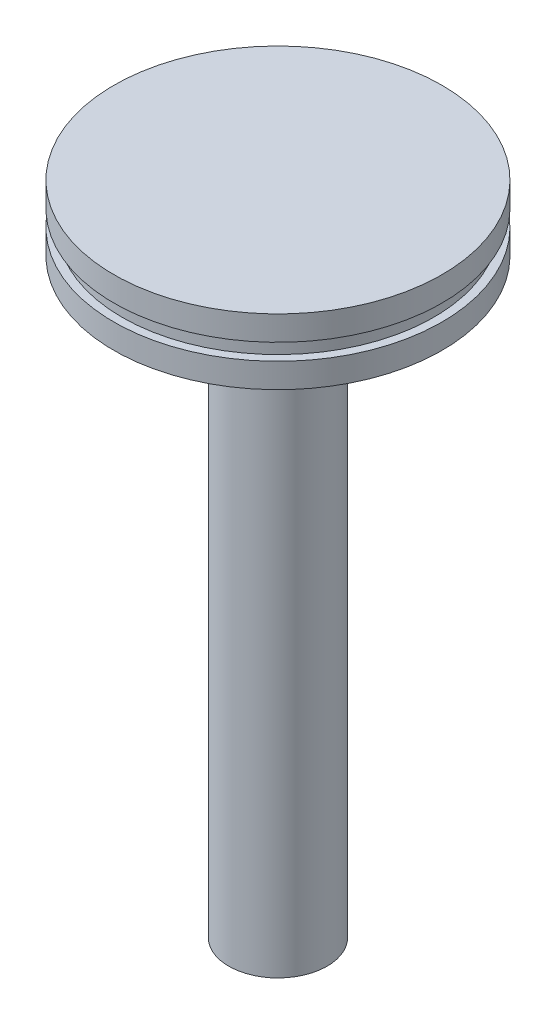
ISO-10303-21;
HEADER;
FILE_DESCRIPTION(('STEP AP214'),'2;1');
FILE_NAME('part.step','',(''),(''),'','','');
FILE_SCHEMA(('AUTOMOTIVE_DESIGN { 1 0 10303 214 1 1 1 1 }'));
ENDSEC;
DATA;
#1=APPLICATION_CONTEXT('core data for automotive mechanical design processes');
#2=APPLICATION_PROTOCOL_DEFINITION('international standard','automotive_design',2000,#1);
#3=PRODUCT_CONTEXT('',#1,'mechanical');
#4=PRODUCT('Part','Part','',(#3));
#5=PRODUCT_RELATED_PRODUCT_CATEGORY('part','',(#4));
#6=PRODUCT_DEFINITION_FORMATION('','',#4);
#7=PRODUCT_DEFINITION_CONTEXT('part definition',#1,'design');
#8=PRODUCT_DEFINITION('design','',#6,#7);
#9=PRODUCT_DEFINITION_SHAPE('','',#8);
#10=(LENGTH_UNIT() NAMED_UNIT(*) SI_UNIT(.MILLI.,.METRE.));
#11=(NAMED_UNIT(*) PLANE_ANGLE_UNIT() SI_UNIT($,.RADIAN.));
#12=(NAMED_UNIT(*) SI_UNIT($,.STERADIAN.) SOLID_ANGLE_UNIT());
#13=UNCERTAINTY_MEASURE_WITH_UNIT(LENGTH_MEASURE(1.E-05),#10,'distance_accuracy_value','');
#14=(GEOMETRIC_REPRESENTATION_CONTEXT(3) GLOBAL_UNCERTAINTY_ASSIGNED_CONTEXT((#13)) GLOBAL_UNIT_ASSIGNED_CONTEXT((#10,
#11,#12)) REPRESENTATION_CONTEXT('',''));
#15=CARTESIAN_POINT('',(0.,0.,0.));
#16=DIRECTION('',(0.,0.,1.));
#17=DIRECTION('',(1.,0.,0.));
#18=AXIS2_PLACEMENT_3D('',#15,#16,#17);
#19=CARTESIAN_POINT('',(0.,17.6696684900402,0.));
#20=DIRECTION('',(0.,1.,0.));
#21=DIRECTION('',(0.,0.,1.));
#22=AXIS2_PLACEMENT_3D('',#19,#20,#21);
#23=PLANE('',#22);
#24=CARTESIAN_POINT('',(0.,17.6696684900402,0.));
#25=DIRECTION('',(0.,-1.,0.));
#26=DIRECTION('',(0.,0.,-1.));
#27=AXIS2_PLACEMENT_3D('',#24,#25,#26);
#28=CIRCLE('',#27,2.89285714285714);
#29=CARTESIAN_POINT('',(0.,17.6696684900402,-2.89285714285714));
#30=VERTEX_POINT('',#29);
#31=EDGE_CURVE('E44',#30,#30,#28,.T.);
#32=ORIENTED_EDGE('',*,*,#31,.F.);
#33=EDGE_LOOP('',(#32));
#34=FACE_BOUND('',#33,.T.);
#35=ADVANCED_FACE('F33',(#34),#23,.T.);
#36=CARTESIAN_POINT('',(0.,6.09823991861166,0.));
#37=DIRECTION('',(0.,-1.,0.));
#38=DIRECTION('',(0.,0.,-1.));
#39=AXIS2_PLACEMENT_3D('',#36,#37,#38);
#40=CYLINDRICAL_SURFACE('',#39,2.89285714285714);
#41=ORIENTED_EDGE('',*,*,#31,.T.);
#42=EDGE_LOOP('',(#41));
#43=FACE_BOUND('',#42,.T.);
#44=CARTESIAN_POINT('',(0.,17.2357399186117,0.));
#45=DIRECTION('',(0.,-1.,0.));
#46=DIRECTION('',(0.,0.,-1.));
#47=AXIS2_PLACEMENT_3D('',#44,#45,#46);
#48=CIRCLE('',#47,2.89285714285714);
#49=CARTESIAN_POINT('',(0.,17.2357399186117,-2.89285714285714));
#50=VERTEX_POINT('',#49);
#51=EDGE_CURVE('E48',#50,#50,#48,.T.);
#52=ORIENTED_EDGE('',*,*,#51,.F.);
#53=EDGE_LOOP('',(#52));
#54=FACE_BOUND('',#53,.T.);
#55=ADVANCED_FACE('F83',(#43,#54),#40,.T.);
#56=CARTESIAN_POINT('',(2.89285714285714,17.2357399186117,0.));
#57=DIRECTION('',(0.,-1.,0.));
#58=DIRECTION('',(0.,0.,-1.));
#59=AXIS2_PLACEMENT_3D('',#56,#57,#58);
#60=PLANE('',#59);
#61=ORIENTED_EDGE('',*,*,#51,.T.);
#62=EDGE_LOOP('',(#61));
#63=FACE_BOUND('',#62,.T.);
#64=CARTESIAN_POINT('',(0.,17.2357399186117,0.));
#65=DIRECTION('',(0.,-1.,0.));
#66=DIRECTION('',(0.,0.,-1.));
#67=AXIS2_PLACEMENT_3D('',#64,#65,#66);
#68=CIRCLE('',#67,2.74821428571428);
#69=CARTESIAN_POINT('',(0.,17.2357399186117,-2.74821428571428));
#70=VERTEX_POINT('',#69);
#71=EDGE_CURVE('E53',#70,#70,#68,.T.);
#72=ORIENTED_EDGE('',*,*,#71,.F.);
#73=EDGE_LOOP('',(#72));
#74=FACE_BOUND('',#73,.T.);
#75=ADVANCED_FACE('F88',(#63,#74),#60,.T.);
#76=CARTESIAN_POINT('',(0.,6.09823991861166,0.));
#77=DIRECTION('',(0.,-1.,0.));
#78=DIRECTION('',(0.,0.,-1.));
#79=AXIS2_PLACEMENT_3D('',#76,#77,#78);
#80=CYLINDRICAL_SURFACE('',#79,2.74821428571428);
#81=ORIENTED_EDGE('',*,*,#71,.T.);
#82=EDGE_LOOP('',(#81));
#83=FACE_BOUND('',#82,.T.);
#84=CARTESIAN_POINT('',(0.,16.9464542043259,0.));
#85=DIRECTION('',(0.,-1.,0.));
#86=DIRECTION('',(0.,0.,-1.));
#87=AXIS2_PLACEMENT_3D('',#84,#85,#86);
#88=CIRCLE('',#87,2.74821428571428);
#89=CARTESIAN_POINT('',(0.,16.9464542043259,-2.74821428571428));
#90=VERTEX_POINT('',#89);
#91=EDGE_CURVE('E56',#90,#90,#88,.T.);
#92=ORIENTED_EDGE('',*,*,#91,.F.);
#93=EDGE_LOOP('',(#92));
#94=FACE_BOUND('',#93,.T.);
#95=ADVANCED_FACE('F95',(#83,#94),#80,.T.);
#96=CARTESIAN_POINT('',(2.74821428571428,16.9464542043259,0.));
#97=DIRECTION('',(0.,1.,0.));
#98=DIRECTION('',(0.,0.,1.));
#99=AXIS2_PLACEMENT_3D('',#96,#97,#98);
#100=PLANE('',#99);
#101=ORIENTED_EDGE('',*,*,#91,.T.);
#102=EDGE_LOOP('',(#101));
#103=FACE_BOUND('',#102,.T.);
#104=CARTESIAN_POINT('',(0.,16.9464542043259,0.));
#105=DIRECTION('',(0.,-1.,0.));
#106=DIRECTION('',(0.,0.,-1.));
#107=AXIS2_PLACEMENT_3D('',#104,#105,#106);
#108=CIRCLE('',#107,2.89285714285714);
#109=CARTESIAN_POINT('',(0.,16.9464542043259,-2.89285714285714));
#110=VERTEX_POINT('',#109);
#111=EDGE_CURVE('E59',#110,#110,#108,.T.);
#112=ORIENTED_EDGE('',*,*,#111,.F.);
#113=EDGE_LOOP('',(#112));
#114=FACE_BOUND('',#113,.T.);
#115=ADVANCED_FACE('F99',(#103,#114),#100,.T.);
#116=CARTESIAN_POINT('',(0.,6.09823991861166,0.));
#117=DIRECTION('',(0.,-1.,0.));
#118=DIRECTION('',(0.,0.,-1.));
#119=AXIS2_PLACEMENT_3D('',#116,#117,#118);
#120=CYLINDRICAL_SURFACE('',#119,2.89285714285714);
#121=ORIENTED_EDGE('',*,*,#111,.T.);
#122=EDGE_LOOP('',(#121));
#123=FACE_BOUND('',#122,.T.);
#124=CARTESIAN_POINT('',(0.,16.5125256328974,0.));
#125=DIRECTION('',(0.,-1.,0.));
#126=DIRECTION('',(0.,0.,-1.));
#127=AXIS2_PLACEMENT_3D('',#124,#125,#126);
#128=CIRCLE('',#127,2.89285714285714);
#129=CARTESIAN_POINT('',(0.,16.5125256328974,-2.89285714285714));
#130=VERTEX_POINT('',#129);
#131=EDGE_CURVE('E62',#130,#130,#128,.T.);
#132=ORIENTED_EDGE('',*,*,#131,.F.);
#133=EDGE_LOOP('',(#132));
#134=FACE_BOUND('',#133,.T.);
#135=ADVANCED_FACE('F80',(#123,#134),#120,.T.);
#136=CARTESIAN_POINT('',(2.89285714285714,16.5125256328974,0.));
#137=DIRECTION('',(0.,-1.,0.));
#138=DIRECTION('',(0.,0.,-1.));
#139=AXIS2_PLACEMENT_3D('',#136,#137,#138);
#140=PLANE('',#139);
#141=CARTESIAN_POINT('',(0.,16.5125256328974,0.));
#142=DIRECTION('',(0.,-1.,0.));
#143=DIRECTION('',(0.,0.,-1.));
#144=AXIS2_PLACEMENT_3D('',#141,#142,#143);
#145=CIRCLE('',#144,1.15714285714286);
#146=CARTESIAN_POINT('',(0.,16.5125256328974,-1.15714285714286));
#147=VERTEX_POINT('',#146);
#148=EDGE_CURVE('E10',#147,#147,#145,.F.);
#149=ORIENTED_EDGE('',*,*,#148,.T.);
#150=EDGE_LOOP('',(#149));
#151=FACE_BOUND('',#150,.T.);
#152=ORIENTED_EDGE('',*,*,#131,.T.);
#153=EDGE_LOOP('',(#152));
#154=FACE_BOUND('',#153,.T.);
#155=ADVANCED_FACE('F73',(#151,#154),#140,.T.);
#156=CARTESIAN_POINT('',(0.,6.09823991861166,0.));
#157=DIRECTION('',(0.,-1.,0.));
#158=DIRECTION('',(0.,0.,-1.));
#159=AXIS2_PLACEMENT_3D('',#156,#157,#158);
#160=CYLINDRICAL_SURFACE('',#159,0.867857142857141);
#161=CARTESIAN_POINT('',(0.,16.2232399186117,0.));
#162=DIRECTION('',(0.,-1.,0.));
#163=DIRECTION('',(0.,0.,-1.));
#164=AXIS2_PLACEMENT_3D('',#161,#162,#163);
#165=CIRCLE('',#164,0.867857142857141);
#166=CARTESIAN_POINT('',(0.,16.2232399186117,-0.867857142857141));
#167=VERTEX_POINT('',#166);
#168=EDGE_CURVE('E40',#167,#167,#165,.T.);
#169=ORIENTED_EDGE('',*,*,#168,.T.);
#170=EDGE_LOOP('',(#169));
#171=FACE_BOUND('',#170,.T.);
#172=CARTESIAN_POINT('',(0.,6.09823991861166,0.));
#173=DIRECTION('',(0.,-1.,0.));
#174=DIRECTION('',(0.,0.,-1.));
#175=AXIS2_PLACEMENT_3D('',#172,#173,#174);
#176=CIRCLE('',#175,0.867857142857142);
#177=CARTESIAN_POINT('',(0.,6.09823991861166,-0.867857142857142));
#178=VERTEX_POINT('',#177);
#179=EDGE_CURVE('E65',#178,#178,#176,.T.);
#180=ORIENTED_EDGE('',*,*,#179,.F.);
#181=EDGE_LOOP('',(#180));
#182=FACE_BOUND('',#181,.T.);
#183=ADVANCED_FACE('F71',(#171,#182),#160,.T.);
#184=CARTESIAN_POINT('',(0.867857142857141,6.09823991861166,0.));
#185=DIRECTION('',(0.,-1.,0.));
#186=DIRECTION('',(0.,0.,-1.));
#187=AXIS2_PLACEMENT_3D('',#184,#185,#186);
#188=PLANE('',#187);
#189=ORIENTED_EDGE('',*,*,#179,.T.);
#190=EDGE_LOOP('',(#189));
#191=FACE_BOUND('',#190,.T.);
#192=ADVANCED_FACE('F69',(#191),#188,.T.);
#193=CARTESIAN_POINT('',(0.,16.2232399186117,0.));
#194=DIRECTION('',(0.,-1.,0.));
#195=DIRECTION('',(0.,0.,-1.));
#196=AXIS2_PLACEMENT_3D('',#193,#194,#195);
#197=TOROIDAL_SURFACE('',#196,1.15714285714286,0.289285714285714);
#198=ORIENTED_EDGE('',*,*,#148,.F.);
#199=EDGE_LOOP('',(#198));
#200=FACE_BOUND('',#199,.T.);
#201=ORIENTED_EDGE('',*,*,#168,.F.);
#202=EDGE_LOOP('',(#201));
#203=FACE_BOUND('',#202,.T.);
#204=ADVANCED_FACE('F35',(#200,#203),#197,.F.);
#205=CLOSED_SHELL('',(#35,#55,#75,#95,#115,#135,#155,#183,#192,#204));
#206=MANIFOLD_SOLID_BREP('B2',#205);
#207=ADVANCED_BREP_SHAPE_REPRESENTATION('',(#18,#206),#14);
#208=SHAPE_DEFINITION_REPRESENTATION(#9,#207);
ENDSEC;
END-ISO-10303-21;
